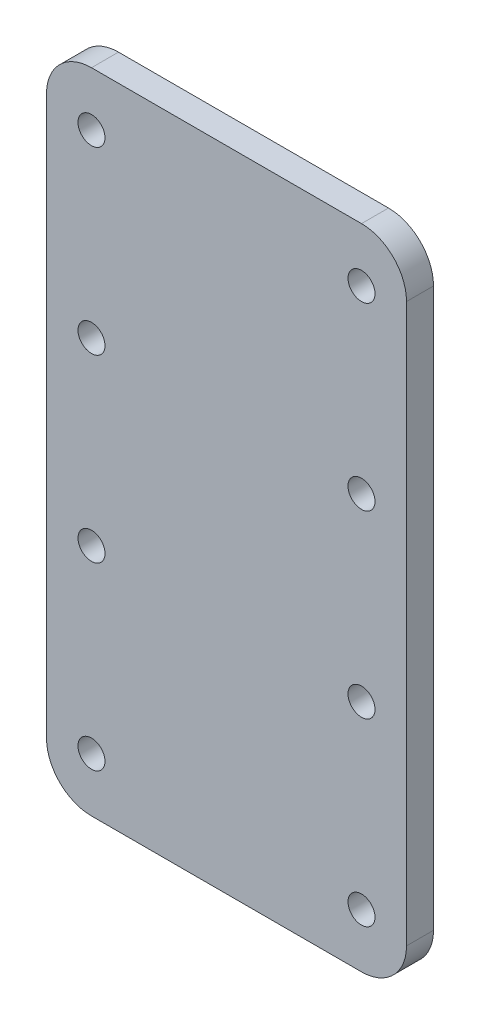
ISO-10303-21;
HEADER;
FILE_DESCRIPTION(('STEP AP214'),'2;1');
FILE_NAME('part.step','',(''),(''),'','','');
FILE_SCHEMA(('AUTOMOTIVE_DESIGN { 1 0 10303 214 1 1 1 1 }'));
ENDSEC;
DATA;
#1=APPLICATION_CONTEXT('core data for automotive mechanical design processes');
#2=APPLICATION_PROTOCOL_DEFINITION('international standard','automotive_design',2000,#1);
#3=PRODUCT_CONTEXT('',#1,'mechanical');
#4=PRODUCT('Part','Part','',(#3));
#5=PRODUCT_RELATED_PRODUCT_CATEGORY('part','',(#4));
#6=PRODUCT_DEFINITION_FORMATION('','',#4);
#7=PRODUCT_DEFINITION_CONTEXT('part definition',#1,'design');
#8=PRODUCT_DEFINITION('design','',#6,#7);
#9=PRODUCT_DEFINITION_SHAPE('','',#8);
#10=(LENGTH_UNIT() NAMED_UNIT(*) SI_UNIT(.MILLI.,.METRE.));
#11=(NAMED_UNIT(*) PLANE_ANGLE_UNIT() SI_UNIT($,.RADIAN.));
#12=(NAMED_UNIT(*) SI_UNIT($,.STERADIAN.) SOLID_ANGLE_UNIT());
#13=UNCERTAINTY_MEASURE_WITH_UNIT(LENGTH_MEASURE(1.E-05),#10,'distance_accuracy_value','');
#14=(GEOMETRIC_REPRESENTATION_CONTEXT(3) GLOBAL_UNCERTAINTY_ASSIGNED_CONTEXT((#13)) GLOBAL_UNIT_ASSIGNED_CONTEXT((#10,
#11,#12)) REPRESENTATION_CONTEXT('',''));
#15=CARTESIAN_POINT('',(0.,0.,0.));
#16=DIRECTION('',(0.,0.,1.));
#17=DIRECTION('',(1.,0.,0.));
#18=AXIS2_PLACEMENT_3D('',#15,#16,#17);
#19=CARTESIAN_POINT('',(20.,-36.,3.));
#20=DIRECTION('',(-1.,0.,0.));
#21=DIRECTION('',(0.,0.,1.));
#22=AXIS2_PLACEMENT_3D('',#19,#20,#21);
#23=PLANE('',#22);
#24=DIRECTION('',(0.,1.,0.));
#25=VECTOR('',#24,1.);
#26=CARTESIAN_POINT('',(20.,-36.,3.));
#27=LINE('',#26,#25);
#28=CARTESIAN_POINT('',(20.,-31.,3.));
#29=VERTEX_POINT('',#28);
#30=CARTESIAN_POINT('',(20.,31.,3.));
#31=VERTEX_POINT('',#30);
#32=EDGE_CURVE('E126',#29,#31,#27,.T.);
#33=ORIENTED_EDGE('',*,*,#32,.F.);
#34=DIRECTION('',(0.,0.,-1.));
#35=VECTOR('',#34,1.);
#36=CARTESIAN_POINT('',(20.,-31.,3.));
#37=LINE('',#36,#35);
#38=CARTESIAN_POINT('',(20.,-31.,0.));
#39=VERTEX_POINT('',#38);
#40=EDGE_CURVE('E152',#29,#39,#37,.T.);
#41=ORIENTED_EDGE('',*,*,#40,.T.);
#42=DIRECTION('',(0.,1.,0.));
#43=VECTOR('',#42,1.);
#44=CARTESIAN_POINT('',(20.,-36.,0.));
#45=LINE('',#44,#43);
#46=CARTESIAN_POINT('',(20.,31.,0.));
#47=VERTEX_POINT('',#46);
#48=EDGE_CURVE('E158',#39,#47,#45,.T.);
#49=ORIENTED_EDGE('',*,*,#48,.T.);
#50=DIRECTION('',(0.,0.,-1.));
#51=VECTOR('',#50,1.);
#52=CARTESIAN_POINT('',(20.,31.,3.));
#53=LINE('',#52,#51);
#54=EDGE_CURVE('E150',#47,#31,#53,.F.);
#55=ORIENTED_EDGE('',*,*,#54,.T.);
#56=EDGE_LOOP('',(#33,#41,#49,#55));
#57=FACE_BOUND('',#56,.T.);
#58=ADVANCED_FACE('F34',(#57),#23,.F.);
#59=CARTESIAN_POINT('',(-20.,36.,3.));
#60=DIRECTION('',(0.,-1.,0.));
#61=DIRECTION('',(0.,0.,-1.));
#62=AXIS2_PLACEMENT_3D('',#59,#60,#61);
#63=PLANE('',#62);
#64=DIRECTION('',(-1.,0.,0.));
#65=VECTOR('',#64,1.);
#66=CARTESIAN_POINT('',(-20.,36.,3.));
#67=LINE('',#66,#65);
#68=CARTESIAN_POINT('',(15.,36.,3.));
#69=VERTEX_POINT('',#68);
#70=CARTESIAN_POINT('',(-15.,36.,3.));
#71=VERTEX_POINT('',#70);
#72=EDGE_CURVE('E129',#69,#71,#67,.T.);
#73=ORIENTED_EDGE('',*,*,#72,.F.);
#74=DIRECTION('',(0.,0.,-1.));
#75=VECTOR('',#74,1.);
#76=CARTESIAN_POINT('',(15.,36.,3.));
#77=LINE('',#76,#75);
#78=CARTESIAN_POINT('',(15.,36.,0.));
#79=VERTEX_POINT('',#78);
#80=EDGE_CURVE('E11',#69,#79,#77,.T.);
#81=ORIENTED_EDGE('',*,*,#80,.T.);
#82=DIRECTION('',(-1.,0.,0.));
#83=VECTOR('',#82,1.);
#84=CARTESIAN_POINT('',(-20.,36.,0.));
#85=LINE('',#84,#83);
#86=CARTESIAN_POINT('',(-15.,36.,0.));
#87=VERTEX_POINT('',#86);
#88=EDGE_CURVE('E131',#79,#87,#85,.T.);
#89=ORIENTED_EDGE('',*,*,#88,.T.);
#90=DIRECTION('',(0.,0.,-1.));
#91=VECTOR('',#90,1.);
#92=CARTESIAN_POINT('',(-15.,36.,3.));
#93=LINE('',#92,#91);
#94=EDGE_CURVE('E42',#87,#71,#93,.F.);
#95=ORIENTED_EDGE('',*,*,#94,.T.);
#96=EDGE_LOOP('',(#73,#81,#89,#95));
#97=FACE_BOUND('',#96,.T.);
#98=ADVANCED_FACE('F245',(#97),#63,.F.);
#99=CARTESIAN_POINT('',(-20.,-36.,3.));
#100=DIRECTION('',(1.,0.,0.));
#101=DIRECTION('',(0.,0.,-1.));
#102=AXIS2_PLACEMENT_3D('',#99,#100,#101);
#103=PLANE('',#102);
#104=DIRECTION('',(0.,-1.,0.));
#105=VECTOR('',#104,1.);
#106=CARTESIAN_POINT('',(-20.,-36.,0.));
#107=LINE('',#106,#105);
#108=CARTESIAN_POINT('',(-20.,31.,0.));
#109=VERTEX_POINT('',#108);
#110=CARTESIAN_POINT('',(-20.,-31.,0.));
#111=VERTEX_POINT('',#110);
#112=EDGE_CURVE('E127',#109,#111,#107,.T.);
#113=ORIENTED_EDGE('',*,*,#112,.T.);
#114=DIRECTION('',(0.,0.,-1.));
#115=VECTOR('',#114,1.);
#116=CARTESIAN_POINT('',(-20.,-31.,3.));
#117=LINE('',#116,#115);
#118=CARTESIAN_POINT('',(-20.,-31.,3.));
#119=VERTEX_POINT('',#118);
#120=EDGE_CURVE('E105',#111,#119,#117,.F.);
#121=ORIENTED_EDGE('',*,*,#120,.T.);
#122=DIRECTION('',(0.,-1.,0.));
#123=VECTOR('',#122,1.);
#124=CARTESIAN_POINT('',(-20.,-36.,3.));
#125=LINE('',#124,#123);
#126=CARTESIAN_POINT('',(-20.,31.,3.));
#127=VERTEX_POINT('',#126);
#128=EDGE_CURVE('E170',#127,#119,#125,.T.);
#129=ORIENTED_EDGE('',*,*,#128,.F.);
#130=DIRECTION('',(0.,0.,-1.));
#131=VECTOR('',#130,1.);
#132=CARTESIAN_POINT('',(-20.,31.,3.));
#133=LINE('',#132,#131);
#134=EDGE_CURVE('E110',#127,#109,#133,.T.);
#135=ORIENTED_EDGE('',*,*,#134,.T.);
#136=EDGE_LOOP('',(#113,#121,#129,#135));
#137=FACE_BOUND('',#136,.T.);
#138=ADVANCED_FACE('F243',(#137),#103,.F.);
#139=CARTESIAN_POINT('',(-20.,-36.,3.));
#140=DIRECTION('',(0.,1.,0.));
#141=DIRECTION('',(0.,0.,1.));
#142=AXIS2_PLACEMENT_3D('',#139,#140,#141);
#143=PLANE('',#142);
#144=DIRECTION('',(1.,0.,0.));
#145=VECTOR('',#144,1.);
#146=CARTESIAN_POINT('',(-20.,-36.,3.));
#147=LINE('',#146,#145);
#148=CARTESIAN_POINT('',(-15.,-36.,3.));
#149=VERTEX_POINT('',#148);
#150=CARTESIAN_POINT('',(15.,-36.,3.));
#151=VERTEX_POINT('',#150);
#152=EDGE_CURVE('E120',#149,#151,#147,.T.);
#153=ORIENTED_EDGE('',*,*,#152,.F.);
#154=DIRECTION('',(0.,0.,-1.));
#155=VECTOR('',#154,1.);
#156=CARTESIAN_POINT('',(-15.,-36.,3.));
#157=LINE('',#156,#155);
#158=CARTESIAN_POINT('',(-15.,-36.,0.));
#159=VERTEX_POINT('',#158);
#160=EDGE_CURVE('E104',#149,#159,#157,.T.);
#161=ORIENTED_EDGE('',*,*,#160,.T.);
#162=DIRECTION('',(1.,0.,0.));
#163=VECTOR('',#162,1.);
#164=CARTESIAN_POINT('',(-20.,-36.,0.));
#165=LINE('',#164,#163);
#166=CARTESIAN_POINT('',(15.,-36.,0.));
#167=VERTEX_POINT('',#166);
#168=EDGE_CURVE('E117',#159,#167,#165,.T.);
#169=ORIENTED_EDGE('',*,*,#168,.T.);
#170=DIRECTION('',(0.,0.,-1.));
#171=VECTOR('',#170,1.);
#172=CARTESIAN_POINT('',(15.,-36.,3.));
#173=LINE('',#172,#171);
#174=EDGE_CURVE('E122',#167,#151,#173,.F.);
#175=ORIENTED_EDGE('',*,*,#174,.T.);
#176=EDGE_LOOP('',(#153,#161,#169,#175));
#177=FACE_BOUND('',#176,.T.);
#178=ADVANCED_FACE('F116',(#177),#143,.F.);
#179=CARTESIAN_POINT('',(0.,0.,3.));
#180=DIRECTION('',(0.,0.,-1.));
#181=DIRECTION('',(-1.,0.,0.));
#182=AXIS2_PLACEMENT_3D('',#179,#180,#181);
#183=PLANE('',#182);
#184=CARTESIAN_POINT('',(-15.,-9.99999999999999,3.));
#185=DIRECTION('',(0.,0.,1.));
#186=DIRECTION('',(-1.,0.,0.));
#187=AXIS2_PLACEMENT_3D('',#184,#185,#186);
#188=CIRCLE('',#187,1.5);
#189=CARTESIAN_POINT('',(-16.5,-9.99999999999999,3.));
#190=VERTEX_POINT('',#189);
#191=EDGE_CURVE('E189',#190,#190,#188,.T.);
#192=ORIENTED_EDGE('',*,*,#191,.F.);
#193=EDGE_LOOP('',(#192));
#194=FACE_BOUND('',#193,.T.);
#195=CARTESIAN_POINT('',(15.,10.,3.));
#196=DIRECTION('',(0.,0.,1.));
#197=DIRECTION('',(1.,0.,0.));
#198=AXIS2_PLACEMENT_3D('',#195,#196,#197);
#199=CIRCLE('',#198,1.5);
#200=CARTESIAN_POINT('',(16.5,10.,3.));
#201=VERTEX_POINT('',#200);
#202=EDGE_CURVE('E196',#201,#201,#199,.T.);
#203=ORIENTED_EDGE('',*,*,#202,.F.);
#204=EDGE_LOOP('',(#203));
#205=FACE_BOUND('',#204,.T.);
#206=CARTESIAN_POINT('',(15.,30.,3.));
#207=DIRECTION('',(0.,0.,1.));
#208=DIRECTION('',(1.,0.,0.));
#209=AXIS2_PLACEMENT_3D('',#206,#207,#208);
#210=CIRCLE('',#209,1.5);
#211=CARTESIAN_POINT('',(16.5,30.,3.));
#212=VERTEX_POINT('',#211);
#213=EDGE_CURVE('E177',#212,#212,#210,.T.);
#214=ORIENTED_EDGE('',*,*,#213,.F.);
#215=EDGE_LOOP('',(#214));
#216=FACE_BOUND('',#215,.T.);
#217=CARTESIAN_POINT('',(-15.,10.,3.));
#218=DIRECTION('',(0.,0.,1.));
#219=DIRECTION('',(1.,0.,0.));
#220=AXIS2_PLACEMENT_3D('',#217,#218,#219);
#221=CIRCLE('',#220,1.5);
#222=CARTESIAN_POINT('',(-13.5,10.,3.));
#223=VERTEX_POINT('',#222);
#224=EDGE_CURVE('E184',#223,#223,#221,.T.);
#225=ORIENTED_EDGE('',*,*,#224,.F.);
#226=EDGE_LOOP('',(#225));
#227=FACE_BOUND('',#226,.T.);
#228=CARTESIAN_POINT('',(15.,-10.,3.));
#229=DIRECTION('',(0.,0.,1.));
#230=DIRECTION('',(-1.,0.,0.));
#231=AXIS2_PLACEMENT_3D('',#228,#229,#230);
#232=CIRCLE('',#231,1.5);
#233=CARTESIAN_POINT('',(13.5,-10.,3.));
#234=VERTEX_POINT('',#233);
#235=EDGE_CURVE('E213',#234,#234,#232,.T.);
#236=ORIENTED_EDGE('',*,*,#235,.F.);
#237=EDGE_LOOP('',(#236));
#238=FACE_BOUND('',#237,.T.);
#239=CARTESIAN_POINT('',(15.,-30.,3.));
#240=DIRECTION('',(0.,0.,1.));
#241=DIRECTION('',(-1.,0.,0.));
#242=AXIS2_PLACEMENT_3D('',#239,#240,#241);
#243=CIRCLE('',#242,1.5);
#244=CARTESIAN_POINT('',(13.5,-30.,3.));
#245=VERTEX_POINT('',#244);
#246=EDGE_CURVE('E207',#245,#245,#243,.T.);
#247=ORIENTED_EDGE('',*,*,#246,.F.);
#248=EDGE_LOOP('',(#247));
#249=FACE_BOUND('',#248,.T.);
#250=CARTESIAN_POINT('',(-15.,-30.,3.));
#251=DIRECTION('',(0.,0.,1.));
#252=DIRECTION('',(-1.,0.,0.));
#253=AXIS2_PLACEMENT_3D('',#250,#251,#252);
#254=CIRCLE('',#253,1.5);
#255=CARTESIAN_POINT('',(-16.5,-30.,3.));
#256=VERTEX_POINT('',#255);
#257=EDGE_CURVE('E201',#256,#256,#254,.T.);
#258=ORIENTED_EDGE('',*,*,#257,.F.);
#259=EDGE_LOOP('',(#258));
#260=FACE_BOUND('',#259,.T.);
#261=CARTESIAN_POINT('',(-15.,30.,3.));
#262=DIRECTION('',(0.,0.,1.));
#263=DIRECTION('',(1.,0.,0.));
#264=AXIS2_PLACEMENT_3D('',#261,#262,#263);
#265=CIRCLE('',#264,1.5);
#266=CARTESIAN_POINT('',(-13.5,30.,3.));
#267=VERTEX_POINT('',#266);
#268=EDGE_CURVE('E166',#267,#267,#265,.T.);
#269=ORIENTED_EDGE('',*,*,#268,.F.);
#270=EDGE_LOOP('',(#269));
#271=FACE_BOUND('',#270,.T.);
#272=ORIENTED_EDGE('',*,*,#128,.T.);
#273=CARTESIAN_POINT('',(-15.,-31.,3.));
#274=DIRECTION('',(0.,0.,-1.));
#275=DIRECTION('',(-1.,0.,0.));
#276=AXIS2_PLACEMENT_3D('',#273,#274,#275);
#277=CIRCLE('',#276,5.);
#278=EDGE_CURVE('E148',#119,#149,#277,.F.);
#279=ORIENTED_EDGE('',*,*,#278,.T.);
#280=ORIENTED_EDGE('',*,*,#152,.T.);
#281=CARTESIAN_POINT('',(15.,-31.,3.));
#282=DIRECTION('',(0.,0.,-1.));
#283=DIRECTION('',(-1.,0.,0.));
#284=AXIS2_PLACEMENT_3D('',#281,#282,#283);
#285=CIRCLE('',#284,5.);
#286=EDGE_CURVE('E146',#151,#29,#285,.F.);
#287=ORIENTED_EDGE('',*,*,#286,.T.);
#288=ORIENTED_EDGE('',*,*,#32,.T.);
#289=CARTESIAN_POINT('',(15.,31.,3.));
#290=DIRECTION('',(0.,0.,-1.));
#291=DIRECTION('',(-1.,0.,0.));
#292=AXIS2_PLACEMENT_3D('',#289,#290,#291);
#293=CIRCLE('',#292,5.);
#294=EDGE_CURVE('E55',#31,#69,#293,.F.);
#295=ORIENTED_EDGE('',*,*,#294,.T.);
#296=ORIENTED_EDGE('',*,*,#72,.T.);
#297=CARTESIAN_POINT('',(-15.,31.,3.));
#298=DIRECTION('',(0.,0.,-1.));
#299=DIRECTION('',(-1.,0.,0.));
#300=AXIS2_PLACEMENT_3D('',#297,#298,#299);
#301=CIRCLE('',#300,5.);
#302=EDGE_CURVE('E143',#71,#127,#301,.F.);
#303=ORIENTED_EDGE('',*,*,#302,.T.);
#304=EDGE_LOOP('',(#272,#279,#280,#287,#288,#295,#296,#303));
#305=FACE_BOUND('',#304,.T.);
#306=ADVANCED_FACE('F229',(#194,#205,#216,#227,#238,#249,#260,#271,#305),#183,.F.);
#307=CARTESIAN_POINT('',(0.,0.,0.));
#308=DIRECTION('',(0.,0.,-1.));
#309=DIRECTION('',(-1.,0.,0.));
#310=AXIS2_PLACEMENT_3D('',#307,#308,#309);
#311=PLANE('',#310);
#312=CARTESIAN_POINT('',(-15.,-9.99999999999999,0.));
#313=DIRECTION('',(0.,0.,1.));
#314=DIRECTION('',(-1.,0.,0.));
#315=AXIS2_PLACEMENT_3D('',#312,#313,#314);
#316=CIRCLE('',#315,1.5);
#317=CARTESIAN_POINT('',(-16.5,-9.99999999999999,0.));
#318=VERTEX_POINT('',#317);
#319=EDGE_CURVE('E192',#318,#318,#316,.T.);
#320=ORIENTED_EDGE('',*,*,#319,.T.);
#321=EDGE_LOOP('',(#320));
#322=FACE_BOUND('',#321,.T.);
#323=CARTESIAN_POINT('',(15.,10.,0.));
#324=DIRECTION('',(0.,0.,1.));
#325=DIRECTION('',(1.,0.,0.));
#326=AXIS2_PLACEMENT_3D('',#323,#324,#325);
#327=CIRCLE('',#326,1.5);
#328=CARTESIAN_POINT('',(16.5,10.,0.));
#329=VERTEX_POINT('',#328);
#330=EDGE_CURVE('E181',#329,#329,#327,.T.);
#331=ORIENTED_EDGE('',*,*,#330,.T.);
#332=EDGE_LOOP('',(#331));
#333=FACE_BOUND('',#332,.T.);
#334=CARTESIAN_POINT('',(15.,30.,0.));
#335=DIRECTION('',(0.,0.,1.));
#336=DIRECTION('',(1.,0.,0.));
#337=AXIS2_PLACEMENT_3D('',#334,#335,#336);
#338=CIRCLE('',#337,1.5);
#339=CARTESIAN_POINT('',(16.5,30.,0.));
#340=VERTEX_POINT('',#339);
#341=EDGE_CURVE('E180',#340,#340,#338,.T.);
#342=ORIENTED_EDGE('',*,*,#341,.T.);
#343=EDGE_LOOP('',(#342));
#344=FACE_BOUND('',#343,.T.);
#345=CARTESIAN_POINT('',(-15.,10.,0.));
#346=DIRECTION('',(0.,0.,1.));
#347=DIRECTION('',(1.,0.,0.));
#348=AXIS2_PLACEMENT_3D('',#345,#346,#347);
#349=CIRCLE('',#348,1.5);
#350=CARTESIAN_POINT('',(-13.5,10.,0.));
#351=VERTEX_POINT('',#350);
#352=EDGE_CURVE('E175',#351,#351,#349,.T.);
#353=ORIENTED_EDGE('',*,*,#352,.T.);
#354=EDGE_LOOP('',(#353));
#355=FACE_BOUND('',#354,.T.);
#356=CARTESIAN_POINT('',(15.,-10.,0.));
#357=DIRECTION('',(0.,0.,1.));
#358=DIRECTION('',(-1.,0.,0.));
#359=AXIS2_PLACEMENT_3D('',#356,#357,#358);
#360=CIRCLE('',#359,1.5);
#361=CARTESIAN_POINT('',(13.5,-10.,0.));
#362=VERTEX_POINT('',#361);
#363=EDGE_CURVE('E193',#362,#362,#360,.T.);
#364=ORIENTED_EDGE('',*,*,#363,.T.);
#365=EDGE_LOOP('',(#364));
#366=FACE_BOUND('',#365,.T.);
#367=CARTESIAN_POINT('',(15.,-30.,0.));
#368=DIRECTION('',(0.,0.,1.));
#369=DIRECTION('',(-1.,0.,0.));
#370=AXIS2_PLACEMENT_3D('',#367,#368,#369);
#371=CIRCLE('',#370,1.5);
#372=CARTESIAN_POINT('',(13.5,-30.,0.));
#373=VERTEX_POINT('',#372);
#374=EDGE_CURVE('E210',#373,#373,#371,.T.);
#375=ORIENTED_EDGE('',*,*,#374,.T.);
#376=EDGE_LOOP('',(#375));
#377=FACE_BOUND('',#376,.T.);
#378=CARTESIAN_POINT('',(-15.,-30.,0.));
#379=DIRECTION('',(0.,0.,1.));
#380=DIRECTION('',(-1.,0.,0.));
#381=AXIS2_PLACEMENT_3D('',#378,#379,#380);
#382=CIRCLE('',#381,1.5);
#383=CARTESIAN_POINT('',(-16.5,-30.,0.));
#384=VERTEX_POINT('',#383);
#385=EDGE_CURVE('E204',#384,#384,#382,.T.);
#386=ORIENTED_EDGE('',*,*,#385,.T.);
#387=EDGE_LOOP('',(#386));
#388=FACE_BOUND('',#387,.T.);
#389=CARTESIAN_POINT('',(-15.,30.,0.));
#390=DIRECTION('',(0.,0.,1.));
#391=DIRECTION('',(1.,0.,0.));
#392=AXIS2_PLACEMENT_3D('',#389,#390,#391);
#393=CIRCLE('',#392,1.5);
#394=CARTESIAN_POINT('',(-13.5,30.,0.));
#395=VERTEX_POINT('',#394);
#396=EDGE_CURVE('E163',#395,#395,#393,.T.);
#397=ORIENTED_EDGE('',*,*,#396,.T.);
#398=EDGE_LOOP('',(#397));
#399=FACE_BOUND('',#398,.T.);
#400=ORIENTED_EDGE('',*,*,#168,.F.);
#401=CARTESIAN_POINT('',(-15.,-31.,0.));
#402=DIRECTION('',(0.,0.,-1.));
#403=DIRECTION('',(-1.,0.,0.));
#404=AXIS2_PLACEMENT_3D('',#401,#402,#403);
#405=CIRCLE('',#404,5.);
#406=EDGE_CURVE('E100',#159,#111,#405,.T.);
#407=ORIENTED_EDGE('',*,*,#406,.T.);
#408=ORIENTED_EDGE('',*,*,#112,.F.);
#409=CARTESIAN_POINT('',(-15.,31.,0.));
#410=DIRECTION('',(0.,0.,-1.));
#411=DIRECTION('',(-1.,0.,0.));
#412=AXIS2_PLACEMENT_3D('',#409,#410,#411);
#413=CIRCLE('',#412,5.);
#414=EDGE_CURVE('E121',#109,#87,#413,.T.);
#415=ORIENTED_EDGE('',*,*,#414,.T.);
#416=ORIENTED_EDGE('',*,*,#88,.F.);
#417=CARTESIAN_POINT('',(15.,31.,0.));
#418=DIRECTION('',(0.,0.,-1.));
#419=DIRECTION('',(-1.,0.,0.));
#420=AXIS2_PLACEMENT_3D('',#417,#418,#419);
#421=CIRCLE('',#420,5.);
#422=EDGE_CURVE('E137',#79,#47,#421,.T.);
#423=ORIENTED_EDGE('',*,*,#422,.T.);
#424=ORIENTED_EDGE('',*,*,#48,.F.);
#425=CARTESIAN_POINT('',(15.,-31.,0.));
#426=DIRECTION('',(0.,0.,-1.));
#427=DIRECTION('',(-1.,0.,0.));
#428=AXIS2_PLACEMENT_3D('',#425,#426,#427);
#429=CIRCLE('',#428,5.);
#430=EDGE_CURVE('E111',#39,#167,#429,.T.);
#431=ORIENTED_EDGE('',*,*,#430,.T.);
#432=EDGE_LOOP('',(#400,#407,#408,#415,#416,#423,#424,#431));
#433=FACE_BOUND('',#432,.T.);
#434=ADVANCED_FACE('F124',(#322,#333,#344,#355,#366,#377,#388,#399,#433),#311,.T.);
#435=CARTESIAN_POINT('',(-15.,30.,0.));
#436=DIRECTION('',(0.,0.,1.));
#437=DIRECTION('',(1.,0.,0.));
#438=AXIS2_PLACEMENT_3D('',#435,#436,#437);
#439=CYLINDRICAL_SURFACE('',#438,1.5);
#440=ORIENTED_EDGE('',*,*,#396,.F.);
#441=EDGE_LOOP('',(#440));
#442=FACE_BOUND('',#441,.T.);
#443=ORIENTED_EDGE('',*,*,#268,.T.);
#444=EDGE_LOOP('',(#443));
#445=FACE_BOUND('',#444,.T.);
#446=ADVANCED_FACE('F270',(#442,#445),#439,.F.);
#447=CARTESIAN_POINT('',(-15.,-30.,0.));
#448=DIRECTION('',(0.,0.,1.));
#449=DIRECTION('',(1.,0.,0.));
#450=AXIS2_PLACEMENT_3D('',#447,#448,#449);
#451=CYLINDRICAL_SURFACE('',#450,1.5);
#452=ORIENTED_EDGE('',*,*,#385,.F.);
#453=EDGE_LOOP('',(#452));
#454=FACE_BOUND('',#453,.T.);
#455=ORIENTED_EDGE('',*,*,#257,.T.);
#456=EDGE_LOOP('',(#455));
#457=FACE_BOUND('',#456,.T.);
#458=ADVANCED_FACE('F275',(#454,#457),#451,.F.);
#459=CARTESIAN_POINT('',(15.,-30.,0.));
#460=DIRECTION('',(0.,0.,1.));
#461=DIRECTION('',(1.,0.,0.));
#462=AXIS2_PLACEMENT_3D('',#459,#460,#461);
#463=CYLINDRICAL_SURFACE('',#462,1.5);
#464=ORIENTED_EDGE('',*,*,#374,.F.);
#465=EDGE_LOOP('',(#464));
#466=FACE_BOUND('',#465,.T.);
#467=ORIENTED_EDGE('',*,*,#246,.T.);
#468=EDGE_LOOP('',(#467));
#469=FACE_BOUND('',#468,.T.);
#470=ADVANCED_FACE('F225',(#466,#469),#463,.F.);
#471=CARTESIAN_POINT('',(15.,-10.,0.));
#472=DIRECTION('',(0.,0.,1.));
#473=DIRECTION('',(1.,0.,0.));
#474=AXIS2_PLACEMENT_3D('',#471,#472,#473);
#475=CYLINDRICAL_SURFACE('',#474,1.5);
#476=ORIENTED_EDGE('',*,*,#363,.F.);
#477=EDGE_LOOP('',(#476));
#478=FACE_BOUND('',#477,.T.);
#479=ORIENTED_EDGE('',*,*,#235,.T.);
#480=EDGE_LOOP('',(#479));
#481=FACE_BOUND('',#480,.T.);
#482=ADVANCED_FACE('F221',(#478,#481),#475,.F.);
#483=CARTESIAN_POINT('',(-15.,10.,0.));
#484=DIRECTION('',(0.,0.,1.));
#485=DIRECTION('',(1.,0.,0.));
#486=AXIS2_PLACEMENT_3D('',#483,#484,#485);
#487=CYLINDRICAL_SURFACE('',#486,1.5);
#488=ORIENTED_EDGE('',*,*,#352,.F.);
#489=EDGE_LOOP('',(#488));
#490=FACE_BOUND('',#489,.T.);
#491=ORIENTED_EDGE('',*,*,#224,.T.);
#492=EDGE_LOOP('',(#491));
#493=FACE_BOUND('',#492,.T.);
#494=ADVANCED_FACE('F224',(#490,#493),#487,.F.);
#495=CARTESIAN_POINT('',(15.,30.,0.));
#496=DIRECTION('',(0.,0.,1.));
#497=DIRECTION('',(1.,0.,0.));
#498=AXIS2_PLACEMENT_3D('',#495,#496,#497);
#499=CYLINDRICAL_SURFACE('',#498,1.5);
#500=ORIENTED_EDGE('',*,*,#341,.F.);
#501=EDGE_LOOP('',(#500));
#502=FACE_BOUND('',#501,.T.);
#503=ORIENTED_EDGE('',*,*,#213,.T.);
#504=EDGE_LOOP('',(#503));
#505=FACE_BOUND('',#504,.T.);
#506=ADVANCED_FACE('F277',(#502,#505),#499,.F.);
#507=CARTESIAN_POINT('',(15.,10.,0.));
#508=DIRECTION('',(0.,0.,1.));
#509=DIRECTION('',(1.,0.,0.));
#510=AXIS2_PLACEMENT_3D('',#507,#508,#509);
#511=CYLINDRICAL_SURFACE('',#510,1.5);
#512=ORIENTED_EDGE('',*,*,#330,.F.);
#513=EDGE_LOOP('',(#512));
#514=FACE_BOUND('',#513,.T.);
#515=ORIENTED_EDGE('',*,*,#202,.T.);
#516=EDGE_LOOP('',(#515));
#517=FACE_BOUND('',#516,.T.);
#518=ADVANCED_FACE('F280',(#514,#517),#511,.F.);
#519=CARTESIAN_POINT('',(-15.,-9.99999999999999,0.));
#520=DIRECTION('',(0.,0.,1.));
#521=DIRECTION('',(1.,0.,0.));
#522=AXIS2_PLACEMENT_3D('',#519,#520,#521);
#523=CYLINDRICAL_SURFACE('',#522,1.5);
#524=ORIENTED_EDGE('',*,*,#319,.F.);
#525=EDGE_LOOP('',(#524));
#526=FACE_BOUND('',#525,.T.);
#527=ORIENTED_EDGE('',*,*,#191,.T.);
#528=EDGE_LOOP('',(#527));
#529=FACE_BOUND('',#528,.T.);
#530=ADVANCED_FACE('F256',(#526,#529),#523,.F.);
#531=CARTESIAN_POINT('',(-15.,-31.,3.));
#532=DIRECTION('',(0.,0.,-1.));
#533=DIRECTION('',(-1.,0.,0.));
#534=AXIS2_PLACEMENT_3D('',#531,#532,#533);
#535=CYLINDRICAL_SURFACE('',#534,5.);
#536=ORIENTED_EDGE('',*,*,#278,.F.);
#537=ORIENTED_EDGE('',*,*,#120,.F.);
#538=ORIENTED_EDGE('',*,*,#406,.F.);
#539=ORIENTED_EDGE('',*,*,#160,.F.);
#540=EDGE_LOOP('',(#536,#537,#538,#539));
#541=FACE_BOUND('',#540,.T.);
#542=ADVANCED_FACE('F103',(#541),#535,.T.);
#543=CARTESIAN_POINT('',(15.,-31.,3.));
#544=DIRECTION('',(0.,0.,-1.));
#545=DIRECTION('',(-1.,0.,0.));
#546=AXIS2_PLACEMENT_3D('',#543,#544,#545);
#547=CYLINDRICAL_SURFACE('',#546,5.);
#548=ORIENTED_EDGE('',*,*,#286,.F.);
#549=ORIENTED_EDGE('',*,*,#174,.F.);
#550=ORIENTED_EDGE('',*,*,#430,.F.);
#551=ORIENTED_EDGE('',*,*,#40,.F.);
#552=EDGE_LOOP('',(#548,#549,#550,#551));
#553=FACE_BOUND('',#552,.T.);
#554=ADVANCED_FACE('F249',(#553),#547,.T.);
#555=CARTESIAN_POINT('',(15.,31.,3.));
#556=DIRECTION('',(0.,0.,-1.));
#557=DIRECTION('',(-1.,0.,0.));
#558=AXIS2_PLACEMENT_3D('',#555,#556,#557);
#559=CYLINDRICAL_SURFACE('',#558,5.);
#560=ORIENTED_EDGE('',*,*,#294,.F.);
#561=ORIENTED_EDGE('',*,*,#54,.F.);
#562=ORIENTED_EDGE('',*,*,#422,.F.);
#563=ORIENTED_EDGE('',*,*,#80,.F.);
#564=EDGE_LOOP('',(#560,#561,#562,#563));
#565=FACE_BOUND('',#564,.T.);
#566=ADVANCED_FACE('F248',(#565),#559,.T.);
#567=CARTESIAN_POINT('',(-15.,31.,3.));
#568=DIRECTION('',(0.,0.,-1.));
#569=DIRECTION('',(-1.,0.,0.));
#570=AXIS2_PLACEMENT_3D('',#567,#568,#569);
#571=CYLINDRICAL_SURFACE('',#570,5.);
#572=ORIENTED_EDGE('',*,*,#302,.F.);
#573=ORIENTED_EDGE('',*,*,#94,.F.);
#574=ORIENTED_EDGE('',*,*,#414,.F.);
#575=ORIENTED_EDGE('',*,*,#134,.F.);
#576=EDGE_LOOP('',(#572,#573,#574,#575));
#577=FACE_BOUND('',#576,.T.);
#578=ADVANCED_FACE('F36',(#577),#571,.T.);
#579=CLOSED_SHELL('',(#58,#98,#138,#178,#306,#434,#446,#458,#470,#482,#494,#506,#518,#530,#542,
#554,#566,#578));
#580=MANIFOLD_SOLID_BREP('B2',#579);
#581=ADVANCED_BREP_SHAPE_REPRESENTATION('',(#18,#580),#14);
#582=SHAPE_DEFINITION_REPRESENTATION(#9,#581);
ENDSEC;
END-ISO-10303-21;
